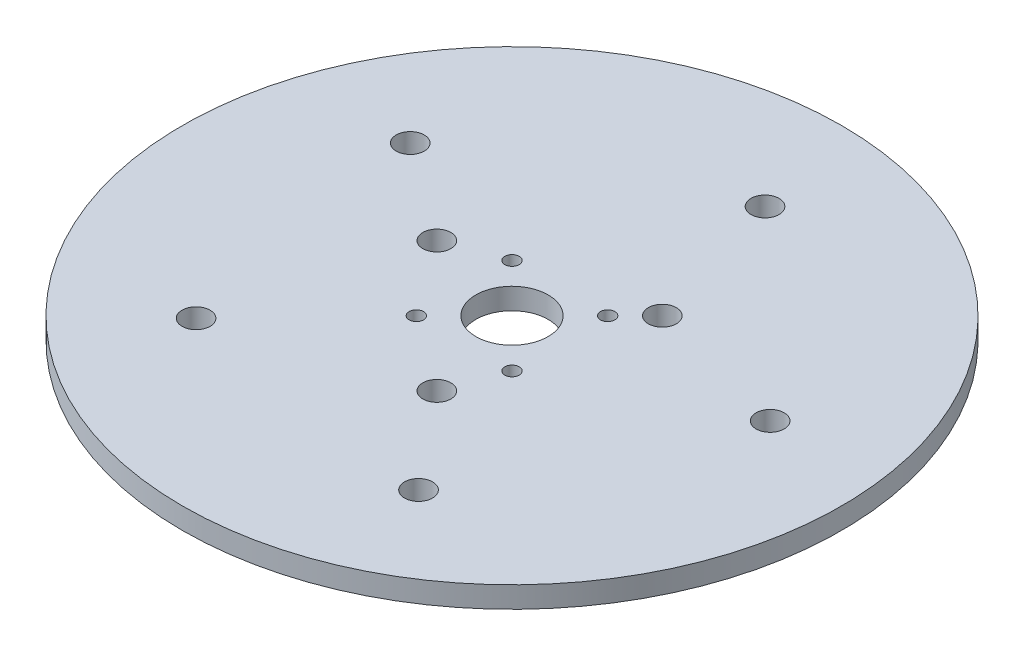
ISO-10303-21;
HEADER;
FILE_DESCRIPTION(('STEP AP214'),'2;1');
FILE_NAME('part.step','',(''),(''),'','','');
FILE_SCHEMA(('AUTOMOTIVE_DESIGN { 1 0 10303 214 1 1 1 1 }'));
ENDSEC;
DATA;
#1=APPLICATION_CONTEXT('core data for automotive mechanical design processes');
#2=APPLICATION_PROTOCOL_DEFINITION('international standard','automotive_design',2000,#1);
#3=PRODUCT_CONTEXT('',#1,'mechanical');
#4=PRODUCT('Part','Part','',(#3));
#5=PRODUCT_RELATED_PRODUCT_CATEGORY('part','',(#4));
#6=PRODUCT_DEFINITION_FORMATION('','',#4);
#7=PRODUCT_DEFINITION_CONTEXT('part definition',#1,'design');
#8=PRODUCT_DEFINITION('design','',#6,#7);
#9=PRODUCT_DEFINITION_SHAPE('','',#8);
#10=(LENGTH_UNIT() NAMED_UNIT(*) SI_UNIT(.MILLI.,.METRE.));
#11=(NAMED_UNIT(*) PLANE_ANGLE_UNIT() SI_UNIT($,.RADIAN.));
#12=(NAMED_UNIT(*) SI_UNIT($,.STERADIAN.) SOLID_ANGLE_UNIT());
#13=UNCERTAINTY_MEASURE_WITH_UNIT(LENGTH_MEASURE(1.E-05),#10,'distance_accuracy_value','');
#14=(GEOMETRIC_REPRESENTATION_CONTEXT(3) GLOBAL_UNCERTAINTY_ASSIGNED_CONTEXT((#13)) GLOBAL_UNIT_ASSIGNED_CONTEXT((#10,
#11,#12)) REPRESENTATION_CONTEXT('',''));
#15=CARTESIAN_POINT('',(0.,0.,0.));
#16=DIRECTION('',(0.,0.,1.));
#17=DIRECTION('',(1.,0.,0.));
#18=AXIS2_PLACEMENT_3D('',#15,#16,#17);
#19=CARTESIAN_POINT('',(0.,5.,0.));
#20=DIRECTION('',(0.,1.,0.));
#21=DIRECTION('',(0.,0.,1.));
#22=AXIS2_PLACEMENT_3D('',#19,#20,#21);
#23=PLANE('',#22);
#24=CARTESIAN_POINT('',(17.6776695296637,5.,-17.6776695296637));
#25=DIRECTION('',(0.,1.,0.));
#26=DIRECTION('',(0.,0.,1.));
#27=AXIS2_PLACEMENT_3D('',#24,#25,#26);
#28=CIRCLE('',#27,3.3);
#29=CARTESIAN_POINT('',(17.6776695296637,5.,-14.3776695296637));
#30=VERTEX_POINT('',#29);
#31=EDGE_CURVE('E118',#30,#30,#28,.T.);
#32=ORIENTED_EDGE('',*,*,#31,.F.);
#33=EDGE_LOOP('',(#32));
#34=FACE_BOUND('',#33,.T.);
#35=CARTESIAN_POINT('',(6.47047612756299,5.,24.1481456572267));
#36=DIRECTION('',(0.,1.,0.));
#37=DIRECTION('',(0.,0.,1.));
#38=AXIS2_PLACEMENT_3D('',#35,#36,#37);
#39=CIRCLE('',#38,3.3);
#40=CARTESIAN_POINT('',(6.47047612756299,5.,27.4481456572267));
#41=VERTEX_POINT('',#40);
#42=EDGE_CURVE('E112',#41,#41,#39,.T.);
#43=ORIENTED_EDGE('',*,*,#42,.F.);
#44=EDGE_LOOP('',(#43));
#45=FACE_BOUND('',#44,.T.);
#46=CARTESIAN_POINT('',(-24.1481456572267,5.,-6.47047612756307));
#47=DIRECTION('',(0.,1.,0.));
#48=DIRECTION('',(0.,0.,1.));
#49=AXIS2_PLACEMENT_3D('',#46,#47,#48);
#50=CIRCLE('',#49,3.3);
#51=CARTESIAN_POINT('',(-24.1481456572267,5.,-3.17047612756307));
#52=VERTEX_POINT('',#51);
#53=EDGE_CURVE('E106',#52,#52,#50,.T.);
#54=ORIENTED_EDGE('',*,*,#53,.F.);
#55=EDGE_LOOP('',(#54));
#56=FACE_BOUND('',#55,.T.);
#57=CARTESIAN_POINT('',(-11.25,5.,-11.25));
#58=DIRECTION('',(0.,1.,0.));
#59=DIRECTION('',(0.,0.,1.));
#60=AXIS2_PLACEMENT_3D('',#57,#58,#59);
#61=CIRCLE('',#60,1.7);
#62=CARTESIAN_POINT('',(-11.25,5.,-9.55));
#63=VERTEX_POINT('',#62);
#64=EDGE_CURVE('E100',#63,#63,#61,.T.);
#65=ORIENTED_EDGE('',*,*,#64,.F.);
#66=EDGE_LOOP('',(#65));
#67=FACE_BOUND('',#66,.T.);
#68=CARTESIAN_POINT('',(11.25,5.,11.25));
#69=DIRECTION('',(0.,1.,0.));
#70=DIRECTION('',(0.,0.,1.));
#71=AXIS2_PLACEMENT_3D('',#68,#69,#70);
#72=CIRCLE('',#71,1.7);
#73=CARTESIAN_POINT('',(11.25,5.,12.95));
#74=VERTEX_POINT('',#73);
#75=EDGE_CURVE('E94',#74,#74,#72,.T.);
#76=ORIENTED_EDGE('',*,*,#75,.F.);
#77=EDGE_LOOP('',(#76));
#78=FACE_BOUND('',#77,.T.);
#79=CARTESIAN_POINT('',(11.25,5.,-11.25));
#80=DIRECTION('',(0.,1.,0.));
#81=DIRECTION('',(0.,0.,1.));
#82=AXIS2_PLACEMENT_3D('',#79,#80,#81);
#83=CIRCLE('',#82,1.7);
#84=CARTESIAN_POINT('',(11.25,5.,-9.55));
#85=VERTEX_POINT('',#84);
#86=EDGE_CURVE('E88',#85,#85,#83,.T.);
#87=ORIENTED_EDGE('',*,*,#86,.F.);
#88=EDGE_LOOP('',(#87));
#89=FACE_BOUND('',#88,.T.);
#90=CARTESIAN_POINT('',(-11.25,5.,11.25));
#91=DIRECTION('',(0.,1.,0.));
#92=DIRECTION('',(0.,0.,1.));
#93=AXIS2_PLACEMENT_3D('',#90,#91,#92);
#94=CIRCLE('',#93,1.7);
#95=CARTESIAN_POINT('',(-11.25,5.,12.95));
#96=VERTEX_POINT('',#95);
#97=EDGE_CURVE('E82',#96,#96,#94,.T.);
#98=ORIENTED_EDGE('',*,*,#97,.F.);
#99=EDGE_LOOP('',(#98));
#100=FACE_BOUND('',#99,.T.);
#101=CARTESIAN_POINT('',(7.49999999999999,5.,-52.));
#102=DIRECTION('',(0.,1.,0.));
#103=DIRECTION('',(0.,0.,1.));
#104=AXIS2_PLACEMENT_3D('',#101,#102,#103);
#105=CIRCLE('',#104,3.29999999999999);
#106=CARTESIAN_POINT('',(7.49999999999999,5.,-48.7));
#107=VERTEX_POINT('',#106);
#108=EDGE_CURVE('E76',#107,#107,#105,.T.);
#109=ORIENTED_EDGE('',*,*,#108,.F.);
#110=EDGE_LOOP('',(#109));
#111=FACE_BOUND('',#110,.T.);
#112=CARTESIAN_POINT('',(51.7725663051602,5.,-8.93595983528274));
#113=DIRECTION('',(0.,1.,0.));
#114=DIRECTION('',(0.,0.,1.));
#115=AXIS2_PLACEMENT_3D('',#112,#113,#114);
#116=CIRCLE('',#115,3.29999999999999);
#117=CARTESIAN_POINT('',(51.7725663051602,5.,-5.63595983528275));
#118=VERTEX_POINT('',#117);
#119=EDGE_CURVE('E70',#118,#118,#116,.T.);
#120=ORIENTED_EDGE('',*,*,#119,.F.);
#121=EDGE_LOOP('',(#120));
#122=FACE_BOUND('',#121,.T.);
#123=CARTESIAN_POINT('',(24.4972056613956,5.,46.4772730996913));
#124=DIRECTION('',(0.,1.,0.));
#125=DIRECTION('',(0.,0.,1.));
#126=AXIS2_PLACEMENT_3D('',#123,#124,#125);
#127=CIRCLE('',#126,3.29999999999999);
#128=CARTESIAN_POINT('',(24.4972056613956,5.,49.7772730996913));
#129=VERTEX_POINT('',#128);
#130=EDGE_CURVE('E64',#129,#129,#127,.T.);
#131=ORIENTED_EDGE('',*,*,#130,.F.);
#132=EDGE_LOOP('',(#131));
#133=FACE_BOUND('',#132,.T.);
#134=CARTESIAN_POINT('',(-36.6324605770207,5.,37.6604943153037));
#135=DIRECTION('',(0.,1.,0.));
#136=DIRECTION('',(0.,0.,1.));
#137=AXIS2_PLACEMENT_3D('',#134,#135,#136);
#138=CIRCLE('',#137,3.29999999999999);
#139=CARTESIAN_POINT('',(-36.6324605770207,5.,40.9604943153037));
#140=VERTEX_POINT('',#139);
#141=EDGE_CURVE('E58',#140,#140,#138,.T.);
#142=ORIENTED_EDGE('',*,*,#141,.F.);
#143=EDGE_LOOP('',(#142));
#144=FACE_BOUND('',#143,.T.);
#145=CARTESIAN_POINT('',(-47.1373113895356,5.,-23.2018075797114));
#146=DIRECTION('',(0.,1.,0.));
#147=DIRECTION('',(0.,0.,1.));
#148=AXIS2_PLACEMENT_3D('',#145,#146,#147);
#149=CIRCLE('',#148,3.29999999999999);
#150=CARTESIAN_POINT('',(-47.1373113895356,5.,-19.9018075797114));
#151=VERTEX_POINT('',#150);
#152=EDGE_CURVE('E52',#151,#151,#149,.T.);
#153=ORIENTED_EDGE('',*,*,#152,.F.);
#154=EDGE_LOOP('',(#153));
#155=FACE_BOUND('',#154,.T.);
#156=CARTESIAN_POINT('',(0.,5.,0.));
#157=DIRECTION('',(0.,1.,0.));
#158=DIRECTION('',(0.,0.,1.));
#159=AXIS2_PLACEMENT_3D('',#156,#157,#158);
#160=CIRCLE('',#159,77.5);
#161=CARTESIAN_POINT('',(0.,5.,77.5));
#162=VERTEX_POINT('',#161);
#163=EDGE_CURVE('E10',#162,#162,#160,.T.);
#164=ORIENTED_EDGE('',*,*,#163,.T.);
#165=EDGE_LOOP('',(#164));
#166=FACE_BOUND('',#165,.T.);
#167=CARTESIAN_POINT('',(0.,5.,0.));
#168=DIRECTION('',(0.,1.,0.));
#169=DIRECTION('',(0.,0.,1.));
#170=AXIS2_PLACEMENT_3D('',#167,#168,#169);
#171=CIRCLE('',#170,8.5);
#172=CARTESIAN_POINT('',(0.,5.,8.5));
#173=VERTEX_POINT('',#172);
#174=EDGE_CURVE('E42',#173,#173,#171,.T.);
#175=ORIENTED_EDGE('',*,*,#174,.F.);
#176=EDGE_LOOP('',(#175));
#177=FACE_BOUND('',#176,.T.);
#178=ADVANCED_FACE('F31',(#34,#45,#56,#67,#78,#89,#100,#111,#122,#133,#144,#155,#166,#177),#23,.T.);
#179=CARTESIAN_POINT('',(0.,0.,0.));
#180=DIRECTION('',(0.,1.,0.));
#181=DIRECTION('',(0.,0.,1.));
#182=AXIS2_PLACEMENT_3D('',#179,#180,#181);
#183=PLANE('',#182);
#184=CARTESIAN_POINT('',(17.6776695296637,0.,-17.6776695296637));
#185=DIRECTION('',(0.,1.,0.));
#186=DIRECTION('',(0.,0.,1.));
#187=AXIS2_PLACEMENT_3D('',#184,#185,#186);
#188=CIRCLE('',#187,3.3);
#189=CARTESIAN_POINT('',(17.6776695296637,0.,-14.3776695296637));
#190=VERTEX_POINT('',#189);
#191=EDGE_CURVE('E115',#190,#190,#188,.T.);
#192=ORIENTED_EDGE('',*,*,#191,.T.);
#193=EDGE_LOOP('',(#192));
#194=FACE_BOUND('',#193,.T.);
#195=CARTESIAN_POINT('',(6.47047612756299,0.,24.1481456572267));
#196=DIRECTION('',(0.,1.,0.));
#197=DIRECTION('',(0.,0.,1.));
#198=AXIS2_PLACEMENT_3D('',#195,#196,#197);
#199=CIRCLE('',#198,3.3);
#200=CARTESIAN_POINT('',(6.47047612756299,0.,27.4481456572267));
#201=VERTEX_POINT('',#200);
#202=EDGE_CURVE('E109',#201,#201,#199,.T.);
#203=ORIENTED_EDGE('',*,*,#202,.T.);
#204=EDGE_LOOP('',(#203));
#205=FACE_BOUND('',#204,.T.);
#206=CARTESIAN_POINT('',(-24.1481456572267,0.,-6.47047612756307));
#207=DIRECTION('',(0.,1.,0.));
#208=DIRECTION('',(0.,0.,1.));
#209=AXIS2_PLACEMENT_3D('',#206,#207,#208);
#210=CIRCLE('',#209,3.3);
#211=CARTESIAN_POINT('',(-24.1481456572267,0.,-3.17047612756307));
#212=VERTEX_POINT('',#211);
#213=EDGE_CURVE('E103',#212,#212,#210,.T.);
#214=ORIENTED_EDGE('',*,*,#213,.T.);
#215=EDGE_LOOP('',(#214));
#216=FACE_BOUND('',#215,.T.);
#217=CARTESIAN_POINT('',(-11.25,0.,-11.25));
#218=DIRECTION('',(0.,1.,0.));
#219=DIRECTION('',(0.,0.,1.));
#220=AXIS2_PLACEMENT_3D('',#217,#218,#219);
#221=CIRCLE('',#220,1.7);
#222=CARTESIAN_POINT('',(-11.25,0.,-9.55));
#223=VERTEX_POINT('',#222);
#224=EDGE_CURVE('E97',#223,#223,#221,.T.);
#225=ORIENTED_EDGE('',*,*,#224,.T.);
#226=EDGE_LOOP('',(#225));
#227=FACE_BOUND('',#226,.T.);
#228=CARTESIAN_POINT('',(11.25,0.,11.25));
#229=DIRECTION('',(0.,1.,0.));
#230=DIRECTION('',(0.,0.,1.));
#231=AXIS2_PLACEMENT_3D('',#228,#229,#230);
#232=CIRCLE('',#231,1.7);
#233=CARTESIAN_POINT('',(11.25,0.,12.95));
#234=VERTEX_POINT('',#233);
#235=EDGE_CURVE('E91',#234,#234,#232,.T.);
#236=ORIENTED_EDGE('',*,*,#235,.T.);
#237=EDGE_LOOP('',(#236));
#238=FACE_BOUND('',#237,.T.);
#239=CARTESIAN_POINT('',(11.25,0.,-11.25));
#240=DIRECTION('',(0.,1.,0.));
#241=DIRECTION('',(0.,0.,1.));
#242=AXIS2_PLACEMENT_3D('',#239,#240,#241);
#243=CIRCLE('',#242,1.7);
#244=CARTESIAN_POINT('',(11.25,0.,-9.55));
#245=VERTEX_POINT('',#244);
#246=EDGE_CURVE('E85',#245,#245,#243,.T.);
#247=ORIENTED_EDGE('',*,*,#246,.T.);
#248=EDGE_LOOP('',(#247));
#249=FACE_BOUND('',#248,.T.);
#250=CARTESIAN_POINT('',(-11.25,0.,11.25));
#251=DIRECTION('',(0.,1.,0.));
#252=DIRECTION('',(0.,0.,1.));
#253=AXIS2_PLACEMENT_3D('',#250,#251,#252);
#254=CIRCLE('',#253,1.7);
#255=CARTESIAN_POINT('',(-11.25,0.,12.95));
#256=VERTEX_POINT('',#255);
#257=EDGE_CURVE('E79',#256,#256,#254,.T.);
#258=ORIENTED_EDGE('',*,*,#257,.T.);
#259=EDGE_LOOP('',(#258));
#260=FACE_BOUND('',#259,.T.);
#261=CARTESIAN_POINT('',(7.49999999999999,0.,-52.));
#262=DIRECTION('',(0.,1.,0.));
#263=DIRECTION('',(0.,0.,1.));
#264=AXIS2_PLACEMENT_3D('',#261,#262,#263);
#265=CIRCLE('',#264,3.3);
#266=CARTESIAN_POINT('',(7.49999999999999,0.,-48.7));
#267=VERTEX_POINT('',#266);
#268=EDGE_CURVE('E73',#267,#267,#265,.T.);
#269=ORIENTED_EDGE('',*,*,#268,.T.);
#270=EDGE_LOOP('',(#269));
#271=FACE_BOUND('',#270,.T.);
#272=CARTESIAN_POINT('',(51.7725663051602,0.,-8.93595983528274));
#273=DIRECTION('',(0.,1.,0.));
#274=DIRECTION('',(0.,0.,1.));
#275=AXIS2_PLACEMENT_3D('',#272,#273,#274);
#276=CIRCLE('',#275,3.3);
#277=CARTESIAN_POINT('',(51.7725663051602,0.,-5.63595983528274));
#278=VERTEX_POINT('',#277);
#279=EDGE_CURVE('E67',#278,#278,#276,.T.);
#280=ORIENTED_EDGE('',*,*,#279,.T.);
#281=EDGE_LOOP('',(#280));
#282=FACE_BOUND('',#281,.T.);
#283=CARTESIAN_POINT('',(24.4972056613956,0.,46.4772730996913));
#284=DIRECTION('',(0.,1.,0.));
#285=DIRECTION('',(0.,0.,1.));
#286=AXIS2_PLACEMENT_3D('',#283,#284,#285);
#287=CIRCLE('',#286,3.3);
#288=CARTESIAN_POINT('',(24.4972056613956,0.,49.7772730996913));
#289=VERTEX_POINT('',#288);
#290=EDGE_CURVE('E61',#289,#289,#287,.T.);
#291=ORIENTED_EDGE('',*,*,#290,.T.);
#292=EDGE_LOOP('',(#291));
#293=FACE_BOUND('',#292,.T.);
#294=CARTESIAN_POINT('',(-36.6324605770207,0.,37.6604943153037));
#295=DIRECTION('',(0.,1.,0.));
#296=DIRECTION('',(0.,0.,1.));
#297=AXIS2_PLACEMENT_3D('',#294,#295,#296);
#298=CIRCLE('',#297,3.3);
#299=CARTESIAN_POINT('',(-36.6324605770207,0.,40.9604943153037));
#300=VERTEX_POINT('',#299);
#301=EDGE_CURVE('E55',#300,#300,#298,.T.);
#302=ORIENTED_EDGE('',*,*,#301,.T.);
#303=EDGE_LOOP('',(#302));
#304=FACE_BOUND('',#303,.T.);
#305=CARTESIAN_POINT('',(-47.1373113895356,0.,-23.2018075797114));
#306=DIRECTION('',(0.,1.,0.));
#307=DIRECTION('',(0.,0.,1.));
#308=AXIS2_PLACEMENT_3D('',#305,#306,#307);
#309=CIRCLE('',#308,3.3);
#310=CARTESIAN_POINT('',(-47.1373113895356,0.,-19.9018075797114));
#311=VERTEX_POINT('',#310);
#312=EDGE_CURVE('E47',#311,#311,#309,.T.);
#313=ORIENTED_EDGE('',*,*,#312,.T.);
#314=EDGE_LOOP('',(#313));
#315=FACE_BOUND('',#314,.T.);
#316=CARTESIAN_POINT('',(0.,0.,0.));
#317=DIRECTION('',(0.,1.,0.));
#318=DIRECTION('',(0.,0.,1.));
#319=AXIS2_PLACEMENT_3D('',#316,#317,#318);
#320=CIRCLE('',#319,77.5);
#321=CARTESIAN_POINT('',(0.,0.,77.5));
#322=VERTEX_POINT('',#321);
#323=EDGE_CURVE('E35',#322,#322,#320,.T.);
#324=ORIENTED_EDGE('',*,*,#323,.F.);
#325=EDGE_LOOP('',(#324));
#326=FACE_BOUND('',#325,.T.);
#327=CARTESIAN_POINT('',(0.,0.,0.));
#328=DIRECTION('',(0.,1.,0.));
#329=DIRECTION('',(0.,0.,1.));
#330=AXIS2_PLACEMENT_3D('',#327,#328,#329);
#331=CIRCLE('',#330,8.5);
#332=CARTESIAN_POINT('',(0.,0.,8.5));
#333=VERTEX_POINT('',#332);
#334=EDGE_CURVE('E44',#333,#333,#331,.T.);
#335=ORIENTED_EDGE('',*,*,#334,.T.);
#336=EDGE_LOOP('',(#335));
#337=FACE_BOUND('',#336,.T.);
#338=ADVANCED_FACE('F126',(#194,#205,#216,#227,#238,#249,#260,#271,#282,#293,#304,#315,#326,
#337),#183,.F.);
#339=CARTESIAN_POINT('',(0.,5.,0.));
#340=DIRECTION('',(0.,-1.,0.));
#341=DIRECTION('',(0.,0.,-1.));
#342=AXIS2_PLACEMENT_3D('',#339,#340,#341);
#343=CYLINDRICAL_SURFACE('',#342,77.5);
#344=ORIENTED_EDGE('',*,*,#163,.F.);
#345=EDGE_LOOP('',(#344));
#346=FACE_BOUND('',#345,.T.);
#347=ORIENTED_EDGE('',*,*,#323,.T.);
#348=EDGE_LOOP('',(#347));
#349=FACE_BOUND('',#348,.T.);
#350=ADVANCED_FACE('F33',(#346,#349),#343,.T.);
#351=CARTESIAN_POINT('',(0.,5.,0.));
#352=DIRECTION('',(0.,-1.,0.));
#353=DIRECTION('',(0.,0.,-1.));
#354=AXIS2_PLACEMENT_3D('',#351,#352,#353);
#355=CYLINDRICAL_SURFACE('',#354,8.5);
#356=ORIENTED_EDGE('',*,*,#174,.T.);
#357=EDGE_LOOP('',(#356));
#358=FACE_BOUND('',#357,.T.);
#359=ORIENTED_EDGE('',*,*,#334,.F.);
#360=EDGE_LOOP('',(#359));
#361=FACE_BOUND('',#360,.T.);
#362=ADVANCED_FACE('F152',(#358,#361),#355,.F.);
#363=CARTESIAN_POINT('',(-47.1373113895356,5.,-23.2018075797114));
#364=DIRECTION('',(0.,1.,0.));
#365=DIRECTION('',(0.,0.,1.));
#366=AXIS2_PLACEMENT_3D('',#363,#364,#365);
#367=CYLINDRICAL_SURFACE('',#366,3.29999999999999);
#368=ORIENTED_EDGE('',*,*,#312,.F.);
#369=EDGE_LOOP('',(#368));
#370=FACE_BOUND('',#369,.T.);
#371=ORIENTED_EDGE('',*,*,#152,.T.);
#372=EDGE_LOOP('',(#371));
#373=FACE_BOUND('',#372,.T.);
#374=ADVANCED_FACE('F155',(#370,#373),#367,.F.);
#375=CARTESIAN_POINT('',(-36.6324605770207,5.,37.6604943153037));
#376=DIRECTION('',(0.,1.,0.));
#377=DIRECTION('',(0.,0.,1.));
#378=AXIS2_PLACEMENT_3D('',#375,#376,#377);
#379=CYLINDRICAL_SURFACE('',#378,3.29999999999999);
#380=ORIENTED_EDGE('',*,*,#301,.F.);
#381=EDGE_LOOP('',(#380));
#382=FACE_BOUND('',#381,.T.);
#383=ORIENTED_EDGE('',*,*,#141,.T.);
#384=EDGE_LOOP('',(#383));
#385=FACE_BOUND('',#384,.T.);
#386=ADVANCED_FACE('F170',(#382,#385),#379,.F.);
#387=CARTESIAN_POINT('',(24.4972056613956,5.,46.4772730996913));
#388=DIRECTION('',(0.,1.,0.));
#389=DIRECTION('',(0.,0.,1.));
#390=AXIS2_PLACEMENT_3D('',#387,#388,#389);
#391=CYLINDRICAL_SURFACE('',#390,3.29999999999999);
#392=ORIENTED_EDGE('',*,*,#290,.F.);
#393=EDGE_LOOP('',(#392));
#394=FACE_BOUND('',#393,.T.);
#395=ORIENTED_EDGE('',*,*,#130,.T.);
#396=EDGE_LOOP('',(#395));
#397=FACE_BOUND('',#396,.T.);
#398=ADVANCED_FACE('F174',(#394,#397),#391,.F.);
#399=CARTESIAN_POINT('',(51.7725663051602,5.,-8.93595983528274));
#400=DIRECTION('',(0.,1.,0.));
#401=DIRECTION('',(0.,0.,1.));
#402=AXIS2_PLACEMENT_3D('',#399,#400,#401);
#403=CYLINDRICAL_SURFACE('',#402,3.29999999999999);
#404=ORIENTED_EDGE('',*,*,#279,.F.);
#405=EDGE_LOOP('',(#404));
#406=FACE_BOUND('',#405,.T.);
#407=ORIENTED_EDGE('',*,*,#119,.T.);
#408=EDGE_LOOP('',(#407));
#409=FACE_BOUND('',#408,.T.);
#410=ADVANCED_FACE('F178',(#406,#409),#403,.F.);
#411=CARTESIAN_POINT('',(7.49999999999999,5.,-52.));
#412=DIRECTION('',(0.,1.,0.));
#413=DIRECTION('',(0.,0.,1.));
#414=AXIS2_PLACEMENT_3D('',#411,#412,#413);
#415=CYLINDRICAL_SURFACE('',#414,3.29999999999999);
#416=ORIENTED_EDGE('',*,*,#268,.F.);
#417=EDGE_LOOP('',(#416));
#418=FACE_BOUND('',#417,.T.);
#419=ORIENTED_EDGE('',*,*,#108,.T.);
#420=EDGE_LOOP('',(#419));
#421=FACE_BOUND('',#420,.T.);
#422=ADVANCED_FACE('F182',(#418,#421),#415,.F.);
#423=CARTESIAN_POINT('',(-11.25,5.,11.25));
#424=DIRECTION('',(0.,1.,0.));
#425=DIRECTION('',(0.,0.,1.));
#426=AXIS2_PLACEMENT_3D('',#423,#424,#425);
#427=CYLINDRICAL_SURFACE('',#426,1.7);
#428=ORIENTED_EDGE('',*,*,#257,.F.);
#429=EDGE_LOOP('',(#428));
#430=FACE_BOUND('',#429,.T.);
#431=ORIENTED_EDGE('',*,*,#97,.T.);
#432=EDGE_LOOP('',(#431));
#433=FACE_BOUND('',#432,.T.);
#434=ADVANCED_FACE('F186',(#430,#433),#427,.F.);
#435=CARTESIAN_POINT('',(11.25,5.,-11.25));
#436=DIRECTION('',(0.,1.,0.));
#437=DIRECTION('',(0.,0.,1.));
#438=AXIS2_PLACEMENT_3D('',#435,#436,#437);
#439=CYLINDRICAL_SURFACE('',#438,1.7);
#440=ORIENTED_EDGE('',*,*,#246,.F.);
#441=EDGE_LOOP('',(#440));
#442=FACE_BOUND('',#441,.T.);
#443=ORIENTED_EDGE('',*,*,#86,.T.);
#444=EDGE_LOOP('',(#443));
#445=FACE_BOUND('',#444,.T.);
#446=ADVANCED_FACE('F190',(#442,#445),#439,.F.);
#447=CARTESIAN_POINT('',(11.25,5.,11.25));
#448=DIRECTION('',(0.,1.,0.));
#449=DIRECTION('',(0.,0.,1.));
#450=AXIS2_PLACEMENT_3D('',#447,#448,#449);
#451=CYLINDRICAL_SURFACE('',#450,1.7);
#452=ORIENTED_EDGE('',*,*,#235,.F.);
#453=EDGE_LOOP('',(#452));
#454=FACE_BOUND('',#453,.T.);
#455=ORIENTED_EDGE('',*,*,#75,.T.);
#456=EDGE_LOOP('',(#455));
#457=FACE_BOUND('',#456,.T.);
#458=ADVANCED_FACE('F194',(#454,#457),#451,.F.);
#459=CARTESIAN_POINT('',(-11.25,5.,-11.25));
#460=DIRECTION('',(0.,1.,0.));
#461=DIRECTION('',(0.,0.,1.));
#462=AXIS2_PLACEMENT_3D('',#459,#460,#461);
#463=CYLINDRICAL_SURFACE('',#462,1.7);
#464=ORIENTED_EDGE('',*,*,#224,.F.);
#465=EDGE_LOOP('',(#464));
#466=FACE_BOUND('',#465,.T.);
#467=ORIENTED_EDGE('',*,*,#64,.T.);
#468=EDGE_LOOP('',(#467));
#469=FACE_BOUND('',#468,.T.);
#470=ADVANCED_FACE('F198',(#466,#469),#463,.F.);
#471=CARTESIAN_POINT('',(-24.1481456572267,5.,-6.47047612756307));
#472=DIRECTION('',(0.,1.,0.));
#473=DIRECTION('',(0.,0.,1.));
#474=AXIS2_PLACEMENT_3D('',#471,#472,#473);
#475=CYLINDRICAL_SURFACE('',#474,3.3);
#476=ORIENTED_EDGE('',*,*,#213,.F.);
#477=EDGE_LOOP('',(#476));
#478=FACE_BOUND('',#477,.T.);
#479=ORIENTED_EDGE('',*,*,#53,.T.);
#480=EDGE_LOOP('',(#479));
#481=FACE_BOUND('',#480,.T.);
#482=ADVANCED_FACE('F202',(#478,#481),#475,.F.);
#483=CARTESIAN_POINT('',(6.47047612756299,5.,24.1481456572267));
#484=DIRECTION('',(0.,1.,0.));
#485=DIRECTION('',(0.,0.,1.));
#486=AXIS2_PLACEMENT_3D('',#483,#484,#485);
#487=CYLINDRICAL_SURFACE('',#486,3.3);
#488=ORIENTED_EDGE('',*,*,#202,.F.);
#489=EDGE_LOOP('',(#488));
#490=FACE_BOUND('',#489,.T.);
#491=ORIENTED_EDGE('',*,*,#42,.T.);
#492=EDGE_LOOP('',(#491));
#493=FACE_BOUND('',#492,.T.);
#494=ADVANCED_FACE('F206',(#490,#493),#487,.F.);
#495=CARTESIAN_POINT('',(17.6776695296637,5.,-17.6776695296637));
#496=DIRECTION('',(0.,1.,0.));
#497=DIRECTION('',(0.,0.,1.));
#498=AXIS2_PLACEMENT_3D('',#495,#496,#497);
#499=CYLINDRICAL_SURFACE('',#498,3.3);
#500=ORIENTED_EDGE('',*,*,#191,.F.);
#501=EDGE_LOOP('',(#500));
#502=FACE_BOUND('',#501,.T.);
#503=ORIENTED_EDGE('',*,*,#31,.T.);
#504=EDGE_LOOP('',(#503));
#505=FACE_BOUND('',#504,.T.);
#506=ADVANCED_FACE('F122',(#502,#505),#499,.F.);
#507=CLOSED_SHELL('',(#178,#338,#350,#362,#374,#386,#398,#410,#422,#434,#446,#458,#470,#482,
#494,#506));
#508=MANIFOLD_SOLID_BREP('B2',#507);
#509=ADVANCED_BREP_SHAPE_REPRESENTATION('',(#18,#508),#14);
#510=SHAPE_DEFINITION_REPRESENTATION(#9,#509);
ENDSEC;
END-ISO-10303-21;
